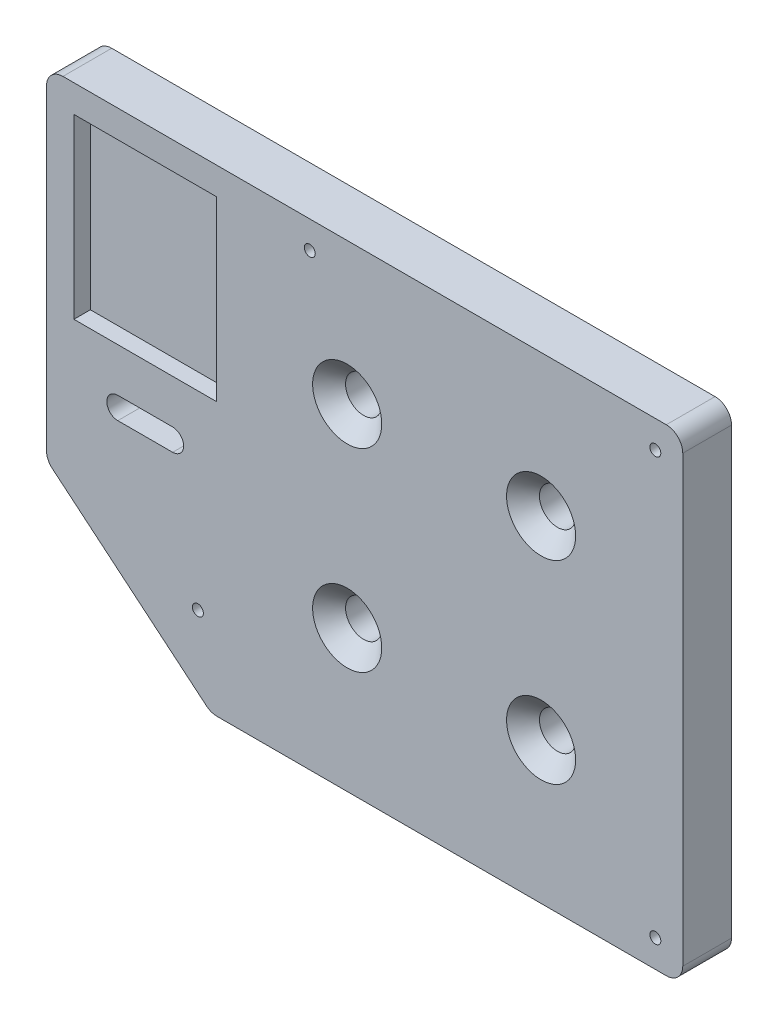
ISO-10303-21;
HEADER;
FILE_DESCRIPTION(('STEP AP214'),'2;1');
FILE_NAME('part.step','',(''),(''),'','','');
FILE_SCHEMA(('AUTOMOTIVE_DESIGN { 1 0 10303 214 1 1 1 1 }'));
ENDSEC;
DATA;
#1=APPLICATION_CONTEXT('core data for automotive mechanical design processes');
#2=APPLICATION_PROTOCOL_DEFINITION('international standard','automotive_design',2000,#1);
#3=PRODUCT_CONTEXT('',#1,'mechanical');
#4=PRODUCT('Part','Part','',(#3));
#5=PRODUCT_RELATED_PRODUCT_CATEGORY('part','',(#4));
#6=PRODUCT_DEFINITION_FORMATION('','',#4);
#7=PRODUCT_DEFINITION_CONTEXT('part definition',#1,'design');
#8=PRODUCT_DEFINITION('design','',#6,#7);
#9=PRODUCT_DEFINITION_SHAPE('','',#8);
#10=(LENGTH_UNIT() NAMED_UNIT(*) SI_UNIT(.MILLI.,.METRE.));
#11=(NAMED_UNIT(*) PLANE_ANGLE_UNIT() SI_UNIT($,.RADIAN.));
#12=(NAMED_UNIT(*) SI_UNIT($,.STERADIAN.) SOLID_ANGLE_UNIT());
#13=UNCERTAINTY_MEASURE_WITH_UNIT(LENGTH_MEASURE(1.E-05),#10,'distance_accuracy_value','');
#14=(GEOMETRIC_REPRESENTATION_CONTEXT(3) GLOBAL_UNCERTAINTY_ASSIGNED_CONTEXT((#13)) GLOBAL_UNIT_ASSIGNED_CONTEXT((#10,
#11,#12)) REPRESENTATION_CONTEXT('',''));
#15=CARTESIAN_POINT('',(0.,0.,0.));
#16=DIRECTION('',(0.,0.,1.));
#17=DIRECTION('',(1.,0.,0.));
#18=AXIS2_PLACEMENT_3D('',#15,#16,#17);
#19=CARTESIAN_POINT('',(0.,0.,-6.));
#20=DIRECTION('',(0.,0.,1.));
#21=DIRECTION('',(1.,0.,0.));
#22=AXIS2_PLACEMENT_3D('',#19,#20,#21);
#23=CYLINDRICAL_SURFACE('',#22,37.5);
#24=CARTESIAN_POINT('',(0.,0.,-4.));
#25=DIRECTION('',(0.,0.,-1.));
#26=DIRECTION('',(-1.,0.,0.));
#27=AXIS2_PLACEMENT_3D('',#24,#25,#26);
#28=CIRCLE('',#27,37.5);
#29=CARTESIAN_POINT('',(-37.5,0.,-4.));
#30=VERTEX_POINT('',#29);
#31=EDGE_CURVE('E299',#30,#30,#28,.T.);
#32=ORIENTED_EDGE('',*,*,#31,.T.);
#33=EDGE_LOOP('',(#32));
#34=FACE_BOUND('',#33,.T.);
#35=CARTESIAN_POINT('',(0.,0.,-6.));
#36=DIRECTION('',(0.,0.,1.));
#37=DIRECTION('',(1.,0.,0.));
#38=AXIS2_PLACEMENT_3D('',#35,#36,#37);
#39=CIRCLE('',#38,37.5);
#40=CARTESIAN_POINT('',(37.5,0.,-6.));
#41=VERTEX_POINT('',#40);
#42=EDGE_CURVE('E293',#41,#41,#39,.T.);
#43=ORIENTED_EDGE('',*,*,#42,.T.);
#44=EDGE_LOOP('',(#43));
#45=FACE_BOUND('',#44,.T.);
#46=ADVANCED_FACE('F33',(#34,#45),#23,.T.);
#47=CARTESIAN_POINT('',(0.,0.,-6.));
#48=DIRECTION('',(0.,0.,1.));
#49=DIRECTION('',(1.,0.,0.));
#50=AXIS2_PLACEMENT_3D('',#47,#48,#49);
#51=PLANE('',#50);
#52=CARTESIAN_POINT('',(0.,0.,-6.));
#53=DIRECTION('',(0.,0.,-1.));
#54=DIRECTION('',(-1.,0.,0.));
#55=AXIS2_PLACEMENT_3D('',#52,#53,#54);
#56=CIRCLE('',#55,31.7);
#57=CARTESIAN_POINT('',(-31.7,0.,-6.));
#58=VERTEX_POINT('',#57);
#59=EDGE_CURVE('E287',#58,#58,#56,.T.);
#60=ORIENTED_EDGE('',*,*,#59,.F.);
#61=EDGE_LOOP('',(#60));
#62=FACE_BOUND('',#61,.T.);
#63=ORIENTED_EDGE('',*,*,#42,.F.);
#64=EDGE_LOOP('',(#63));
#65=FACE_BOUND('',#64,.T.);
#66=ADVANCED_FACE('F397',(#62,#65),#51,.F.);
#67=CARTESIAN_POINT('',(0.,0.,89.6611398544542));
#68=DIRECTION('',(0.,0.,-1.));
#69=DIRECTION('',(-1.,0.,0.));
#70=AXIS2_PLACEMENT_3D('',#67,#68,#69);
#71=CYLINDRICAL_SURFACE('',#70,31.7);
#72=ORIENTED_EDGE('',*,*,#59,.T.);
#73=EDGE_LOOP('',(#72));
#74=FACE_BOUND('',#73,.T.);
#75=CARTESIAN_POINT('',(0.,0.,0.));
#76=DIRECTION('',(0.,0.,1.));
#77=DIRECTION('',(1.,0.,0.));
#78=AXIS2_PLACEMENT_3D('',#75,#76,#77);
#79=CIRCLE('',#78,31.7);
#80=CARTESIAN_POINT('',(31.7,0.,0.));
#81=VERTEX_POINT('',#80);
#82=EDGE_CURVE('E290',#81,#81,#79,.F.);
#83=ORIENTED_EDGE('',*,*,#82,.F.);
#84=EDGE_LOOP('',(#83));
#85=FACE_BOUND('',#84,.T.);
#86=ADVANCED_FACE('F403',(#74,#85),#71,.F.);
#87=CARTESIAN_POINT('',(0.,0.,0.));
#88=DIRECTION('',(0.,0.,-1.));
#89=DIRECTION('',(-1.,0.,0.));
#90=AXIS2_PLACEMENT_3D('',#87,#88,#89);
#91=PLANE('',#90);
#92=CARTESIAN_POINT('',(38.5,-38.5,0.));
#93=DIRECTION('',(0.,0.,-1.));
#94=DIRECTION('',(-1.,0.,0.));
#95=AXIS2_PLACEMENT_3D('',#92,#93,#94);
#96=CIRCLE('',#95,0.999999999999998);
#97=CARTESIAN_POINT('',(37.5,-38.5,0.));
#98=VERTEX_POINT('',#97);
#99=EDGE_CURVE('E787',#98,#98,#96,.F.);
#100=ORIENTED_EDGE('',*,*,#99,.T.);
#101=EDGE_LOOP('',(#100));
#102=FACE_BOUND('',#101,.T.);
#103=CARTESIAN_POINT('',(38.5,38.5,0.));
#104=DIRECTION('',(0.,0.,-1.));
#105=DIRECTION('',(-1.,0.,0.));
#106=AXIS2_PLACEMENT_3D('',#103,#104,#105);
#107=CIRCLE('',#106,0.999999999999998);
#108=CARTESIAN_POINT('',(37.5,38.5,0.));
#109=VERTEX_POINT('',#108);
#110=EDGE_CURVE('E791',#109,#109,#107,.F.);
#111=ORIENTED_EDGE('',*,*,#110,.T.);
#112=EDGE_LOOP('',(#111));
#113=FACE_BOUND('',#112,.T.);
#114=CARTESIAN_POINT('',(-24.5,38.5,0.));
#115=DIRECTION('',(0.,0.,-1.));
#116=DIRECTION('',(-1.,0.,0.));
#117=AXIS2_PLACEMENT_3D('',#114,#115,#116);
#118=CIRCLE('',#117,0.999999999999998);
#119=CARTESIAN_POINT('',(-25.5,38.5,0.));
#120=VERTEX_POINT('',#119);
#121=EDGE_CURVE('E795',#120,#120,#118,.F.);
#122=ORIENTED_EDGE('',*,*,#121,.T.);
#123=EDGE_LOOP('',(#122));
#124=FACE_BOUND('',#123,.T.);
#125=CARTESIAN_POINT('',(-44.898080813822,-28.4620661203998,0.));
#126=DIRECTION('',(0.,0.,-1.));
#127=DIRECTION('',(-1.,0.,0.));
#128=AXIS2_PLACEMENT_3D('',#125,#126,#127);
#129=CIRCLE('',#128,0.999999999999998);
#130=CARTESIAN_POINT('',(-45.898080813822,-28.4620661203998,0.));
#131=VERTEX_POINT('',#130);
#132=EDGE_CURVE('E798',#131,#131,#129,.F.);
#133=ORIENTED_EDGE('',*,*,#132,.T.);
#134=EDGE_LOOP('',(#133));
#135=FACE_BOUND('',#134,.T.);
#136=DIRECTION('',(-1.,0.,0.));
#137=VECTOR('',#136,1.);
#138=CARTESIAN_POINT('',(-49.5,-1.85000000000001,0.));
#139=LINE('',#138,#137);
#140=CARTESIAN_POINT('',(-49.5,-1.85000000000001,0.));
#141=VERTEX_POINT('',#140);
#142=CARTESIAN_POINT('',(-59.5,-1.85000000000001,0.));
#143=VERTEX_POINT('',#142);
#144=EDGE_CURVE('E173',#141,#143,#139,.T.);
#145=ORIENTED_EDGE('',*,*,#144,.T.);
#146=CARTESIAN_POINT('',(-59.5,-3.85000000000001,0.));
#147=DIRECTION('',(0.,0.,-1.));
#148=DIRECTION('',(-1.,0.,0.));
#149=AXIS2_PLACEMENT_3D('',#146,#147,#148);
#150=CIRCLE('',#149,2.);
#151=CARTESIAN_POINT('',(-59.5,-5.85000000000001,0.));
#152=VERTEX_POINT('',#151);
#153=EDGE_CURVE('E159',#143,#152,#150,.F.);
#154=ORIENTED_EDGE('',*,*,#153,.T.);
#155=DIRECTION('',(1.,0.,0.));
#156=VECTOR('',#155,1.);
#157=CARTESIAN_POINT('',(-49.5,-5.85,0.));
#158=LINE('',#157,#156);
#159=CARTESIAN_POINT('',(-49.5,-5.85,0.));
#160=VERTEX_POINT('',#159);
#161=EDGE_CURVE('E192',#152,#160,#158,.T.);
#162=ORIENTED_EDGE('',*,*,#161,.T.);
#163=CARTESIAN_POINT('',(-49.5,-3.85000000000001,0.));
#164=DIRECTION('',(0.,0.,-1.));
#165=DIRECTION('',(-1.,0.,0.));
#166=AXIS2_PLACEMENT_3D('',#163,#164,#165);
#167=CIRCLE('',#166,2.);
#168=EDGE_CURVE('E180',#160,#141,#167,.F.);
#169=ORIENTED_EDGE('',*,*,#168,.T.);
#170=EDGE_LOOP('',(#145,#154,#162,#169));
#171=FACE_BOUND('',#170,.T.);
#172=DIRECTION('',(0.,1.,0.));
#173=VECTOR('',#172,1.);
#174=CARTESIAN_POINT('',(43.5,-43.5,0.));
#175=LINE('',#174,#173);
#176=CARTESIAN_POINT('',(43.5,-40.5,0.));
#177=VERTEX_POINT('',#176);
#178=CARTESIAN_POINT('',(43.5,40.5,0.));
#179=VERTEX_POINT('',#178);
#180=EDGE_CURVE('E236',#177,#179,#175,.T.);
#181=ORIENTED_EDGE('',*,*,#180,.F.);
#182=CARTESIAN_POINT('',(40.5,-40.5,0.));
#183=DIRECTION('',(0.,0.,-1.));
#184=DIRECTION('',(-1.,0.,0.));
#185=AXIS2_PLACEMENT_3D('',#182,#183,#184);
#186=CIRCLE('',#185,3.);
#187=CARTESIAN_POINT('',(40.5,-43.5,0.));
#188=VERTEX_POINT('',#187);
#189=EDGE_CURVE('E337',#177,#188,#186,.T.);
#190=ORIENTED_EDGE('',*,*,#189,.T.);
#191=DIRECTION('',(1.,0.,0.));
#192=VECTOR('',#191,1.);
#193=CARTESIAN_POINT('',(43.5,-43.5,0.));
#194=LINE('',#193,#192);
#195=CARTESIAN_POINT('',(-41.413850194456,-43.5,0.));
#196=VERTEX_POINT('',#195);
#197=EDGE_CURVE('E255',#196,#188,#194,.T.);
#198=ORIENTED_EDGE('',*,*,#197,.F.);
#199=CARTESIAN_POINT('',(-41.413850194456,-40.5,0.));
#200=DIRECTION('',(0.,0.,-1.));
#201=DIRECTION('',(-1.,0.,0.));
#202=AXIS2_PLACEMENT_3D('',#199,#200,#201);
#203=CIRCLE('',#202,3.);
#204=CARTESIAN_POINT('',(-43.3344033934495,-42.8046638387921,0.));
#205=VERTEX_POINT('',#204);
#206=EDGE_CURVE('E335',#196,#205,#203,.T.);
#207=ORIENTED_EDGE('',*,*,#206,.T.);
#208=DIRECTION('',(-0.768221279597376,0.64018439966448,0.));
#209=VECTOR('',#208,1.);
#210=CARTESIAN_POINT('',(-42.5,-43.5,0.));
#211=LINE('',#210,#209);
#212=CARTESIAN_POINT('',(-71.4205531989934,-19.3995390008388,0.));
#213=VERTEX_POINT('',#212);
#214=EDGE_CURVE('E233',#205,#213,#211,.T.);
#215=ORIENTED_EDGE('',*,*,#214,.T.);
#216=CARTESIAN_POINT('',(-69.5,-17.0948751620467,0.));
#217=DIRECTION('',(0.,0.,-1.));
#218=DIRECTION('',(-1.,0.,0.));
#219=AXIS2_PLACEMENT_3D('',#216,#217,#218);
#220=CIRCLE('',#219,3.);
#221=CARTESIAN_POINT('',(-72.5,-17.0948751620467,0.));
#222=VERTEX_POINT('',#221);
#223=EDGE_CURVE('E333',#213,#222,#220,.T.);
#224=ORIENTED_EDGE('',*,*,#223,.T.);
#225=DIRECTION('',(0.,-1.,0.));
#226=VECTOR('',#225,1.);
#227=CARTESIAN_POINT('',(-72.5,-43.5,0.));
#228=LINE('',#227,#226);
#229=CARTESIAN_POINT('',(-72.5,40.5,0.));
#230=VERTEX_POINT('',#229);
#231=EDGE_CURVE('E252',#230,#222,#228,.T.);
#232=ORIENTED_EDGE('',*,*,#231,.F.);
#233=CARTESIAN_POINT('',(-69.5,40.5,0.));
#234=DIRECTION('',(0.,0.,-1.));
#235=DIRECTION('',(-1.,0.,0.));
#236=AXIS2_PLACEMENT_3D('',#233,#234,#235);
#237=CIRCLE('',#236,3.);
#238=CARTESIAN_POINT('',(-69.5,43.5,0.));
#239=VERTEX_POINT('',#238);
#240=EDGE_CURVE('E48',#230,#239,#237,.T.);
#241=ORIENTED_EDGE('',*,*,#240,.T.);
#242=DIRECTION('',(-1.,0.,0.));
#243=VECTOR('',#242,1.);
#244=CARTESIAN_POINT('',(43.5,43.5,0.));
#245=LINE('',#244,#243);
#246=CARTESIAN_POINT('',(40.5,43.5,0.));
#247=VERTEX_POINT('',#246);
#248=EDGE_CURVE('E250',#247,#239,#245,.T.);
#249=ORIENTED_EDGE('',*,*,#248,.F.);
#250=CARTESIAN_POINT('',(40.5,40.5,0.));
#251=DIRECTION('',(0.,0.,-1.));
#252=DIRECTION('',(-1.,0.,0.));
#253=AXIS2_PLACEMENT_3D('',#250,#251,#252);
#254=CIRCLE('',#253,3.);
#255=EDGE_CURVE('E330',#247,#179,#254,.T.);
#256=ORIENTED_EDGE('',*,*,#255,.T.);
#257=EDGE_LOOP('',(#181,#190,#198,#207,#215,#224,#232,#241,#249,#256));
#258=FACE_BOUND('',#257,.T.);
#259=CARTESIAN_POINT('',(0.,0.,0.));
#260=DIRECTION('',(0.,0.,-1.));
#261=DIRECTION('',(-1.,0.,0.));
#262=AXIS2_PLACEMENT_3D('',#259,#260,#261);
#263=CIRCLE('',#262,41.5);
#264=CARTESIAN_POINT('',(-41.5,0.,0.));
#265=VERTEX_POINT('',#264);
#266=EDGE_CURVE('E296',#265,#265,#263,.F.);
#267=ORIENTED_EDGE('',*,*,#266,.T.);
#268=EDGE_LOOP('',(#267));
#269=FACE_BOUND('',#268,.T.);
#270=ADVANCED_FACE('F179',(#102,#113,#124,#135,#171,#258,#269),#91,.T.);
#271=CARTESIAN_POINT('',(-17.6776695296638,17.6776695296636,0.));
#272=DIRECTION('',(0.,0.,-1.));
#273=DIRECTION('',(-1.,0.,0.));
#274=AXIS2_PLACEMENT_3D('',#271,#272,#273);
#275=CIRCLE('',#274,3.3);
#276=CARTESIAN_POINT('',(-20.9776695296638,17.6776695296636,0.));
#277=VERTEX_POINT('',#276);
#278=EDGE_CURVE('E265',#277,#277,#275,.T.);
#279=ORIENTED_EDGE('',*,*,#278,.F.);
#280=EDGE_LOOP('',(#279));
#281=FACE_BOUND('',#280,.T.);
#282=CARTESIAN_POINT('',(-17.6776695296637,-17.6776695296637,0.));
#283=DIRECTION('',(0.,0.,-1.));
#284=DIRECTION('',(-1.,0.,0.));
#285=AXIS2_PLACEMENT_3D('',#282,#283,#284);
#286=CIRCLE('',#285,3.3);
#287=CARTESIAN_POINT('',(-20.9776695296637,-17.6776695296637,0.));
#288=VERTEX_POINT('',#287);
#289=EDGE_CURVE('E272',#288,#288,#286,.T.);
#290=ORIENTED_EDGE('',*,*,#289,.F.);
#291=EDGE_LOOP('',(#290));
#292=FACE_BOUND('',#291,.T.);
#293=CARTESIAN_POINT('',(17.6776695296638,-17.6776695296636,0.));
#294=DIRECTION('',(0.,0.,-1.));
#295=DIRECTION('',(-1.,0.,0.));
#296=AXIS2_PLACEMENT_3D('',#293,#294,#295);
#297=CIRCLE('',#296,3.3);
#298=CARTESIAN_POINT('',(14.3776695296638,-17.6776695296636,0.));
#299=VERTEX_POINT('',#298);
#300=EDGE_CURVE('E279',#299,#299,#297,.T.);
#301=ORIENTED_EDGE('',*,*,#300,.F.);
#302=EDGE_LOOP('',(#301));
#303=FACE_BOUND('',#302,.T.);
#304=CARTESIAN_POINT('',(17.6776695296637,17.6776695296637,0.));
#305=DIRECTION('',(0.,0.,-1.));
#306=DIRECTION('',(-1.,0.,0.));
#307=AXIS2_PLACEMENT_3D('',#304,#305,#306);
#308=CIRCLE('',#307,3.3);
#309=CARTESIAN_POINT('',(14.3776695296637,17.6776695296637,0.));
#310=VERTEX_POINT('',#309);
#311=EDGE_CURVE('E286',#310,#310,#308,.T.);
#312=ORIENTED_EDGE('',*,*,#311,.F.);
#313=EDGE_LOOP('',(#312));
#314=FACE_BOUND('',#313,.T.);
#315=ORIENTED_EDGE('',*,*,#82,.T.);
#316=EDGE_LOOP('',(#315));
#317=FACE_BOUND('',#316,.T.);
#318=ADVANCED_FACE('F412',(#281,#292,#303,#314,#317),#91,.T.);
#319=CARTESIAN_POINT('',(0.,0.,-4.));
#320=DIRECTION('',(0.,0.,-1.));
#321=DIRECTION('',(-1.,0.,0.));
#322=AXIS2_PLACEMENT_3D('',#319,#320,#321);
#323=TOROIDAL_SURFACE('',#322,41.5,4.);
#324=ORIENTED_EDGE('',*,*,#31,.F.);
#325=EDGE_LOOP('',(#324));
#326=FACE_BOUND('',#325,.T.);
#327=ORIENTED_EDGE('',*,*,#266,.F.);
#328=EDGE_LOOP('',(#327));
#329=FACE_BOUND('',#328,.T.);
#330=ADVANCED_FACE('F409',(#326,#329),#323,.F.);
#331=CARTESIAN_POINT('',(0.,0.,8.89));
#332=DIRECTION('',(0.,0.,-1.));
#333=DIRECTION('',(-1.,0.,0.));
#334=AXIS2_PLACEMENT_3D('',#331,#332,#333);
#335=PLANE('',#334);
#336=CARTESIAN_POINT('',(38.5,-38.5,8.89));
#337=DIRECTION('',(0.,0.,1.));
#338=DIRECTION('',(1.,0.,0.));
#339=AXIS2_PLACEMENT_3D('',#336,#337,#338);
#340=CIRCLE('',#339,0.999999999999998);
#341=CARTESIAN_POINT('',(39.5,-38.5,8.89));
#342=VERTEX_POINT('',#341);
#343=EDGE_CURVE('E811',#342,#342,#340,.T.);
#344=ORIENTED_EDGE('',*,*,#343,.F.);
#345=EDGE_LOOP('',(#344));
#346=FACE_BOUND('',#345,.T.);
#347=CARTESIAN_POINT('',(38.5,38.5,8.89));
#348=DIRECTION('',(0.,0.,1.));
#349=DIRECTION('',(1.,0.,0.));
#350=AXIS2_PLACEMENT_3D('',#347,#348,#349);
#351=CIRCLE('',#350,0.999999999999998);
#352=CARTESIAN_POINT('',(39.5,38.5,8.89));
#353=VERTEX_POINT('',#352);
#354=EDGE_CURVE('E815',#353,#353,#351,.T.);
#355=ORIENTED_EDGE('',*,*,#354,.F.);
#356=EDGE_LOOP('',(#355));
#357=FACE_BOUND('',#356,.T.);
#358=CARTESIAN_POINT('',(-24.5,38.5,8.89));
#359=DIRECTION('',(0.,0.,1.));
#360=DIRECTION('',(1.,0.,0.));
#361=AXIS2_PLACEMENT_3D('',#358,#359,#360);
#362=CIRCLE('',#361,0.999999999999998);
#363=CARTESIAN_POINT('',(-23.5,38.5,8.89));
#364=VERTEX_POINT('',#363);
#365=EDGE_CURVE('E800',#364,#364,#362,.T.);
#366=ORIENTED_EDGE('',*,*,#365,.F.);
#367=EDGE_LOOP('',(#366));
#368=FACE_BOUND('',#367,.T.);
#369=CARTESIAN_POINT('',(-44.898080813822,-28.4620661203998,8.89));
#370=DIRECTION('',(0.,0.,1.));
#371=DIRECTION('',(1.,0.,0.));
#372=AXIS2_PLACEMENT_3D('',#369,#370,#371);
#373=CIRCLE('',#372,0.999999999999998);
#374=CARTESIAN_POINT('',(-43.898080813822,-28.4620661203998,8.89));
#375=VERTEX_POINT('',#374);
#376=EDGE_CURVE('E801',#375,#375,#373,.T.);
#377=ORIENTED_EDGE('',*,*,#376,.F.);
#378=EDGE_LOOP('',(#377));
#379=FACE_BOUND('',#378,.T.);
#380=CARTESIAN_POINT('',(-59.5,-3.85000000000001,8.89));
#381=DIRECTION('',(0.,0.,1.));
#382=DIRECTION('',(1.,0.,0.));
#383=AXIS2_PLACEMENT_3D('',#380,#381,#382);
#384=CIRCLE('',#383,2.);
#385=CARTESIAN_POINT('',(-59.5,-1.85000000000001,8.89));
#386=VERTEX_POINT('',#385);
#387=CARTESIAN_POINT('',(-59.5,-5.85000000000001,8.89));
#388=VERTEX_POINT('',#387);
#389=EDGE_CURVE('E183',#386,#388,#384,.T.);
#390=ORIENTED_EDGE('',*,*,#389,.F.);
#391=DIRECTION('',(-1.,0.,0.));
#392=VECTOR('',#391,1.);
#393=CARTESIAN_POINT('',(-49.5,-1.85000000000001,8.89));
#394=LINE('',#393,#392);
#395=CARTESIAN_POINT('',(-49.5,-1.85000000000001,8.89));
#396=VERTEX_POINT('',#395);
#397=EDGE_CURVE('E176',#396,#386,#394,.T.);
#398=ORIENTED_EDGE('',*,*,#397,.F.);
#399=CARTESIAN_POINT('',(-49.5,-3.85000000000001,8.89));
#400=DIRECTION('',(0.,0.,1.));
#401=DIRECTION('',(1.,0.,0.));
#402=AXIS2_PLACEMENT_3D('',#399,#400,#401);
#403=CIRCLE('',#402,2.);
#404=CARTESIAN_POINT('',(-49.5,-5.85,8.89));
#405=VERTEX_POINT('',#404);
#406=EDGE_CURVE('E187',#405,#396,#403,.T.);
#407=ORIENTED_EDGE('',*,*,#406,.F.);
#408=DIRECTION('',(1.,0.,0.));
#409=VECTOR('',#408,1.);
#410=CARTESIAN_POINT('',(-49.5,-5.85,8.89));
#411=LINE('',#410,#409);
#412=EDGE_CURVE('E181',#388,#405,#411,.T.);
#413=ORIENTED_EDGE('',*,*,#412,.F.);
#414=EDGE_LOOP('',(#390,#398,#407,#413));
#415=FACE_BOUND('',#414,.T.);
#416=DIRECTION('',(0.,-1.,0.));
#417=VECTOR('',#416,1.);
#418=CARTESIAN_POINT('',(-67.5,38.5,8.89));
#419=LINE('',#418,#417);
#420=CARTESIAN_POINT('',(-67.5,38.5,8.89));
#421=VERTEX_POINT('',#420);
#422=CARTESIAN_POINT('',(-67.5,6.14999999999999,8.89));
#423=VERTEX_POINT('',#422);
#424=EDGE_CURVE('E214',#421,#423,#419,.T.);
#425=ORIENTED_EDGE('',*,*,#424,.F.);
#426=DIRECTION('',(-1.,0.,0.));
#427=VECTOR('',#426,1.);
#428=CARTESIAN_POINT('',(-41.5,38.5,8.89));
#429=LINE('',#428,#427);
#430=CARTESIAN_POINT('',(-41.5,38.5,8.89));
#431=VERTEX_POINT('',#430);
#432=EDGE_CURVE('E198',#431,#421,#429,.T.);
#433=ORIENTED_EDGE('',*,*,#432,.F.);
#434=DIRECTION('',(0.,1.,0.));
#435=VECTOR('',#434,1.);
#436=CARTESIAN_POINT('',(-41.5,6.14999999999999,8.89));
#437=LINE('',#436,#435);
#438=CARTESIAN_POINT('',(-41.5,6.14999999999999,8.89));
#439=VERTEX_POINT('',#438);
#440=EDGE_CURVE('E203',#439,#431,#437,.T.);
#441=ORIENTED_EDGE('',*,*,#440,.F.);
#442=DIRECTION('',(1.,0.,0.));
#443=VECTOR('',#442,1.);
#444=CARTESIAN_POINT('',(-67.5,6.14999999999999,8.89));
#445=LINE('',#444,#443);
#446=EDGE_CURVE('E217',#423,#439,#445,.T.);
#447=ORIENTED_EDGE('',*,*,#446,.F.);
#448=EDGE_LOOP('',(#425,#433,#441,#447));
#449=FACE_BOUND('',#448,.T.);
#450=CARTESIAN_POINT('',(-17.6776695296638,17.6776695296636,8.89));
#451=DIRECTION('',(0.,0.,1.));
#452=DIRECTION('',(1.,0.,0.));
#453=AXIS2_PLACEMENT_3D('',#450,#451,#452);
#454=CIRCLE('',#453,6.3);
#455=CARTESIAN_POINT('',(-11.3776695296638,17.6776695296636,8.89));
#456=VERTEX_POINT('',#455);
#457=EDGE_CURVE('E240',#456,#456,#454,.T.);
#458=ORIENTED_EDGE('',*,*,#457,.F.);
#459=EDGE_LOOP('',(#458));
#460=FACE_BOUND('',#459,.T.);
#461=CARTESIAN_POINT('',(-17.6776695296637,-17.6776695296637,8.89));
#462=DIRECTION('',(0.,0.,1.));
#463=DIRECTION('',(1.,0.,0.));
#464=AXIS2_PLACEMENT_3D('',#461,#462,#463);
#465=CIRCLE('',#464,6.3);
#466=CARTESIAN_POINT('',(-11.3776695296637,-17.6776695296637,8.89));
#467=VERTEX_POINT('',#466);
#468=EDGE_CURVE('E266',#467,#467,#465,.T.);
#469=ORIENTED_EDGE('',*,*,#468,.F.);
#470=EDGE_LOOP('',(#469));
#471=FACE_BOUND('',#470,.T.);
#472=CARTESIAN_POINT('',(17.6776695296638,-17.6776695296636,8.89));
#473=DIRECTION('',(0.,0.,1.));
#474=DIRECTION('',(1.,0.,0.));
#475=AXIS2_PLACEMENT_3D('',#472,#473,#474);
#476=CIRCLE('',#475,6.3);
#477=CARTESIAN_POINT('',(23.9776695296638,-17.6776695296636,8.89));
#478=VERTEX_POINT('',#477);
#479=EDGE_CURVE('E273',#478,#478,#476,.T.);
#480=ORIENTED_EDGE('',*,*,#479,.F.);
#481=EDGE_LOOP('',(#480));
#482=FACE_BOUND('',#481,.T.);
#483=CARTESIAN_POINT('',(17.6776695296637,17.6776695296637,8.89));
#484=DIRECTION('',(0.,0.,1.));
#485=DIRECTION('',(1.,0.,0.));
#486=AXIS2_PLACEMENT_3D('',#483,#484,#485);
#487=CIRCLE('',#486,6.3);
#488=CARTESIAN_POINT('',(23.9776695296637,17.6776695296637,8.89));
#489=VERTEX_POINT('',#488);
#490=EDGE_CURVE('E280',#489,#489,#487,.T.);
#491=ORIENTED_EDGE('',*,*,#490,.F.);
#492=EDGE_LOOP('',(#491));
#493=FACE_BOUND('',#492,.T.);
#494=DIRECTION('',(1.,0.,0.));
#495=VECTOR('',#494,1.);
#496=CARTESIAN_POINT('',(43.5,-43.5,8.89));
#497=LINE('',#496,#495);
#498=CARTESIAN_POINT('',(-41.413850194456,-43.5,8.89));
#499=VERTEX_POINT('',#498);
#500=CARTESIAN_POINT('',(40.5,-43.5,8.89));
#501=VERTEX_POINT('',#500);
#502=EDGE_CURVE('E237',#499,#501,#497,.T.);
#503=ORIENTED_EDGE('',*,*,#502,.T.);
#504=CARTESIAN_POINT('',(40.5,-40.5,8.89000000000001));
#505=DIRECTION('',(0.,0.,-1.));
#506=DIRECTION('',(-1.,0.,0.));
#507=AXIS2_PLACEMENT_3D('',#504,#505,#506);
#508=CIRCLE('',#507,3.);
#509=CARTESIAN_POINT('',(43.5,-40.5,8.89));
#510=VERTEX_POINT('',#509);
#511=EDGE_CURVE('E323',#501,#510,#508,.F.);
#512=ORIENTED_EDGE('',*,*,#511,.T.);
#513=DIRECTION('',(0.,1.,0.));
#514=VECTOR('',#513,1.);
#515=CARTESIAN_POINT('',(43.5,-43.5,8.89));
#516=LINE('',#515,#514);
#517=CARTESIAN_POINT('',(43.5,40.5,8.89));
#518=VERTEX_POINT('',#517);
#519=EDGE_CURVE('E247',#510,#518,#516,.T.);
#520=ORIENTED_EDGE('',*,*,#519,.T.);
#521=CARTESIAN_POINT('',(40.5,40.5,8.89000000000001));
#522=DIRECTION('',(0.,0.,-1.));
#523=DIRECTION('',(-1.,0.,0.));
#524=AXIS2_PLACEMENT_3D('',#521,#522,#523);
#525=CIRCLE('',#524,3.);
#526=CARTESIAN_POINT('',(40.5,43.5,8.89));
#527=VERTEX_POINT('',#526);
#528=EDGE_CURVE('E315',#518,#527,#525,.F.);
#529=ORIENTED_EDGE('',*,*,#528,.T.);
#530=DIRECTION('',(-1.,0.,0.));
#531=VECTOR('',#530,1.);
#532=CARTESIAN_POINT('',(43.5,43.5,8.89));
#533=LINE('',#532,#531);
#534=CARTESIAN_POINT('',(-69.5,43.5,8.89));
#535=VERTEX_POINT('',#534);
#536=EDGE_CURVE('E244',#527,#535,#533,.T.);
#537=ORIENTED_EDGE('',*,*,#536,.T.);
#538=CARTESIAN_POINT('',(-69.5,40.5,8.89000000000001));
#539=DIRECTION('',(0.,0.,-1.));
#540=DIRECTION('',(-1.,0.,0.));
#541=AXIS2_PLACEMENT_3D('',#538,#539,#540);
#542=CIRCLE('',#541,3.);
#543=CARTESIAN_POINT('',(-72.5,40.5,8.89));
#544=VERTEX_POINT('',#543);
#545=EDGE_CURVE('E317',#535,#544,#542,.F.);
#546=ORIENTED_EDGE('',*,*,#545,.T.);
#547=DIRECTION('',(0.,-1.,0.));
#548=VECTOR('',#547,1.);
#549=CARTESIAN_POINT('',(-72.5,-43.5,8.89));
#550=LINE('',#549,#548);
#551=CARTESIAN_POINT('',(-72.5,-17.0948751620467,8.89));
#552=VERTEX_POINT('',#551);
#553=EDGE_CURVE('E241',#544,#552,#550,.T.);
#554=ORIENTED_EDGE('',*,*,#553,.T.);
#555=CARTESIAN_POINT('',(-69.5,-17.0948751620467,8.89000000000001));
#556=DIRECTION('',(0.,0.,-1.));
#557=DIRECTION('',(-1.,0.,0.));
#558=AXIS2_PLACEMENT_3D('',#555,#556,#557);
#559=CIRCLE('',#558,3.);
#560=CARTESIAN_POINT('',(-71.4205531989934,-19.3995390008388,8.89));
#561=VERTEX_POINT('',#560);
#562=EDGE_CURVE('E319',#552,#561,#559,.F.);
#563=ORIENTED_EDGE('',*,*,#562,.T.);
#564=DIRECTION('',(-0.768221279597376,0.64018439966448,0.));
#565=VECTOR('',#564,1.);
#566=CARTESIAN_POINT('',(-42.5,-43.5,8.89));
#567=LINE('',#566,#565);
#568=CARTESIAN_POINT('',(-43.3344033934495,-42.8046638387921,8.89));
#569=VERTEX_POINT('',#568);
#570=EDGE_CURVE('E224',#569,#561,#567,.T.);
#571=ORIENTED_EDGE('',*,*,#570,.F.);
#572=CARTESIAN_POINT('',(-41.413850194456,-40.5,8.89));
#573=DIRECTION('',(0.,0.,-1.));
#574=DIRECTION('',(-1.,0.,0.));
#575=AXIS2_PLACEMENT_3D('',#572,#573,#574);
#576=CIRCLE('',#575,3.);
#577=EDGE_CURVE('E321',#569,#499,#576,.F.);
#578=ORIENTED_EDGE('',*,*,#577,.T.);
#579=EDGE_LOOP('',(#503,#512,#520,#529,#537,#546,#554,#563,#571,#578));
#580=FACE_BOUND('',#579,.T.);
#581=ADVANCED_FACE('F356',(#346,#357,#368,#379,#415,#449,#460,#471,#482,#493,#580),#335,.F.);
#582=CARTESIAN_POINT('',(17.6776695296637,17.6776695296637,8.89));
#583=DIRECTION('',(0.,0.,1.));
#584=DIRECTION('',(1.,0.,0.));
#585=AXIS2_PLACEMENT_3D('',#582,#583,#584);
#586=CYLINDRICAL_SURFACE('',#585,3.3);
#587=ORIENTED_EDGE('',*,*,#311,.T.);
#588=EDGE_LOOP('',(#587));
#589=FACE_BOUND('',#588,.T.);
#590=CARTESIAN_POINT('',(17.6776695296637,17.6776695296637,5.89));
#591=DIRECTION('',(0.,0.,1.));
#592=DIRECTION('',(1.,0.,0.));
#593=AXIS2_PLACEMENT_3D('',#590,#591,#592);
#594=CIRCLE('',#593,3.3);
#595=CARTESIAN_POINT('',(20.9776695296637,17.6776695296637,5.89));
#596=VERTEX_POINT('',#595);
#597=EDGE_CURVE('E283',#596,#596,#594,.T.);
#598=ORIENTED_EDGE('',*,*,#597,.T.);
#599=EDGE_LOOP('',(#598));
#600=FACE_BOUND('',#599,.T.);
#601=ADVANCED_FACE('F507',(#589,#600),#586,.F.);
#602=CARTESIAN_POINT('',(17.6776695296637,17.6776695296637,8.89));
#603=DIRECTION('',(0.,0.,1.));
#604=DIRECTION('',(1.,0.,0.));
#605=AXIS2_PLACEMENT_3D('',#602,#603,#604);
#606=CONICAL_SURFACE('',#605,6.3,0.785398163397448);
#607=ORIENTED_EDGE('',*,*,#597,.F.);
#608=EDGE_LOOP('',(#607));
#609=FACE_BOUND('',#608,.T.);
#610=ORIENTED_EDGE('',*,*,#490,.T.);
#611=EDGE_LOOP('',(#610));
#612=FACE_BOUND('',#611,.T.);
#613=ADVANCED_FACE('F503',(#609,#612),#606,.F.);
#614=CARTESIAN_POINT('',(17.6776695296638,-17.6776695296636,8.89));
#615=DIRECTION('',(0.,0.,1.));
#616=DIRECTION('',(1.,0.,0.));
#617=AXIS2_PLACEMENT_3D('',#614,#615,#616);
#618=CYLINDRICAL_SURFACE('',#617,3.3);
#619=ORIENTED_EDGE('',*,*,#300,.T.);
#620=EDGE_LOOP('',(#619));
#621=FACE_BOUND('',#620,.T.);
#622=CARTESIAN_POINT('',(17.6776695296638,-17.6776695296636,5.89));
#623=DIRECTION('',(0.,0.,1.));
#624=DIRECTION('',(1.,0.,0.));
#625=AXIS2_PLACEMENT_3D('',#622,#623,#624);
#626=CIRCLE('',#625,3.3);
#627=CARTESIAN_POINT('',(20.9776695296638,-17.6776695296636,5.89));
#628=VERTEX_POINT('',#627);
#629=EDGE_CURVE('E276',#628,#628,#626,.T.);
#630=ORIENTED_EDGE('',*,*,#629,.T.);
#631=EDGE_LOOP('',(#630));
#632=FACE_BOUND('',#631,.T.);
#633=ADVANCED_FACE('F499',(#621,#632),#618,.F.);
#634=CARTESIAN_POINT('',(17.6776695296638,-17.6776695296636,8.89));
#635=DIRECTION('',(0.,0.,1.));
#636=DIRECTION('',(1.,0.,0.));
#637=AXIS2_PLACEMENT_3D('',#634,#635,#636);
#638=CONICAL_SURFACE('',#637,6.3,0.785398163397448);
#639=ORIENTED_EDGE('',*,*,#629,.F.);
#640=EDGE_LOOP('',(#639));
#641=FACE_BOUND('',#640,.T.);
#642=ORIENTED_EDGE('',*,*,#479,.T.);
#643=EDGE_LOOP('',(#642));
#644=FACE_BOUND('',#643,.T.);
#645=ADVANCED_FACE('F495',(#641,#644),#638,.F.);
#646=CARTESIAN_POINT('',(-17.6776695296637,-17.6776695296637,8.89));
#647=DIRECTION('',(0.,0.,1.));
#648=DIRECTION('',(1.,0.,0.));
#649=AXIS2_PLACEMENT_3D('',#646,#647,#648);
#650=CYLINDRICAL_SURFACE('',#649,3.3);
#651=ORIENTED_EDGE('',*,*,#289,.T.);
#652=EDGE_LOOP('',(#651));
#653=FACE_BOUND('',#652,.T.);
#654=CARTESIAN_POINT('',(-17.6776695296637,-17.6776695296637,5.89));
#655=DIRECTION('',(0.,0.,1.));
#656=DIRECTION('',(1.,0.,0.));
#657=AXIS2_PLACEMENT_3D('',#654,#655,#656);
#658=CIRCLE('',#657,3.3);
#659=CARTESIAN_POINT('',(-14.3776695296637,-17.6776695296637,5.89));
#660=VERTEX_POINT('',#659);
#661=EDGE_CURVE('E269',#660,#660,#658,.T.);
#662=ORIENTED_EDGE('',*,*,#661,.T.);
#663=EDGE_LOOP('',(#662));
#664=FACE_BOUND('',#663,.T.);
#665=ADVANCED_FACE('F491',(#653,#664),#650,.F.);
#666=CARTESIAN_POINT('',(-17.6776695296637,-17.6776695296637,8.89));
#667=DIRECTION('',(0.,0.,1.));
#668=DIRECTION('',(1.,0.,0.));
#669=AXIS2_PLACEMENT_3D('',#666,#667,#668);
#670=CONICAL_SURFACE('',#669,6.3,0.785398163397448);
#671=ORIENTED_EDGE('',*,*,#661,.F.);
#672=EDGE_LOOP('',(#671));
#673=FACE_BOUND('',#672,.T.);
#674=ORIENTED_EDGE('',*,*,#468,.T.);
#675=EDGE_LOOP('',(#674));
#676=FACE_BOUND('',#675,.T.);
#677=ADVANCED_FACE('F487',(#673,#676),#670,.F.);
#678=CARTESIAN_POINT('',(-17.6776695296638,17.6776695296636,8.89));
#679=DIRECTION('',(0.,0.,1.));
#680=DIRECTION('',(1.,0.,0.));
#681=AXIS2_PLACEMENT_3D('',#678,#679,#680);
#682=CYLINDRICAL_SURFACE('',#681,3.3);
#683=ORIENTED_EDGE('',*,*,#278,.T.);
#684=EDGE_LOOP('',(#683));
#685=FACE_BOUND('',#684,.T.);
#686=CARTESIAN_POINT('',(-17.6776695296638,17.6776695296636,5.89));
#687=DIRECTION('',(0.,0.,1.));
#688=DIRECTION('',(1.,0.,0.));
#689=AXIS2_PLACEMENT_3D('',#686,#687,#688);
#690=CIRCLE('',#689,3.3);
#691=CARTESIAN_POINT('',(-14.3776695296638,17.6776695296636,5.89));
#692=VERTEX_POINT('',#691);
#693=EDGE_CURVE('E262',#692,#692,#690,.T.);
#694=ORIENTED_EDGE('',*,*,#693,.T.);
#695=EDGE_LOOP('',(#694));
#696=FACE_BOUND('',#695,.T.);
#697=ADVANCED_FACE('F483',(#685,#696),#682,.F.);
#698=CARTESIAN_POINT('',(-17.6776695296638,17.6776695296636,8.89));
#699=DIRECTION('',(0.,0.,1.));
#700=DIRECTION('',(1.,0.,0.));
#701=AXIS2_PLACEMENT_3D('',#698,#699,#700);
#702=CONICAL_SURFACE('',#701,6.3,0.785398163397448);
#703=ORIENTED_EDGE('',*,*,#693,.F.);
#704=EDGE_LOOP('',(#703));
#705=FACE_BOUND('',#704,.T.);
#706=ORIENTED_EDGE('',*,*,#457,.T.);
#707=EDGE_LOOP('',(#706));
#708=FACE_BOUND('',#707,.T.);
#709=ADVANCED_FACE('F480',(#705,#708),#702,.F.);
#710=CARTESIAN_POINT('',(43.5,-43.5,-145.));
#711=DIRECTION('',(1.,0.,0.));
#712=DIRECTION('',(0.,1.,0.));
#713=AXIS2_PLACEMENT_3D('',#710,#711,#712);
#714=PLANE('',#713);
#715=ORIENTED_EDGE('',*,*,#519,.F.);
#716=DIRECTION('',(0.,0.,1.));
#717=VECTOR('',#716,1.);
#718=CARTESIAN_POINT('',(43.5,-40.5,-145.));
#719=LINE('',#718,#717);
#720=EDGE_CURVE('E328',#510,#177,#719,.F.);
#721=ORIENTED_EDGE('',*,*,#720,.T.);
#722=ORIENTED_EDGE('',*,*,#180,.T.);
#723=DIRECTION('',(0.,0.,1.));
#724=VECTOR('',#723,1.);
#725=CARTESIAN_POINT('',(43.5,40.5,-145.));
#726=LINE('',#725,#724);
#727=EDGE_CURVE('E325',#179,#518,#726,.T.);
#728=ORIENTED_EDGE('',*,*,#727,.T.);
#729=EDGE_LOOP('',(#715,#721,#722,#728));
#730=FACE_BOUND('',#729,.T.);
#731=ADVANCED_FACE('F369',(#730),#714,.T.);
#732=CARTESIAN_POINT('',(43.5,-43.5,-145.));
#733=DIRECTION('',(0.,-1.,0.));
#734=DIRECTION('',(1.,0.,0.));
#735=AXIS2_PLACEMENT_3D('',#732,#733,#734);
#736=PLANE('',#735);
#737=ORIENTED_EDGE('',*,*,#197,.T.);
#738=DIRECTION('',(0.,0.,1.));
#739=VECTOR('',#738,1.);
#740=CARTESIAN_POINT('',(40.5,-43.5,-145.));
#741=LINE('',#740,#739);
#742=EDGE_CURVE('E312',#188,#501,#741,.T.);
#743=ORIENTED_EDGE('',*,*,#742,.T.);
#744=ORIENTED_EDGE('',*,*,#502,.F.);
#745=DIRECTION('',(0.,0.,1.));
#746=VECTOR('',#745,1.);
#747=CARTESIAN_POINT('',(-41.413850194456,-43.5,0.));
#748=LINE('',#747,#746);
#749=EDGE_CURVE('E302',#499,#196,#748,.F.);
#750=ORIENTED_EDGE('',*,*,#749,.T.);
#751=EDGE_LOOP('',(#737,#743,#744,#750));
#752=FACE_BOUND('',#751,.T.);
#753=ADVANCED_FACE('F377',(#752),#736,.T.);
#754=CARTESIAN_POINT('',(-72.5,-43.5,-145.));
#755=DIRECTION('',(-1.,0.,0.));
#756=DIRECTION('',(0.,0.,1.));
#757=AXIS2_PLACEMENT_3D('',#754,#755,#756);
#758=PLANE('',#757);
#759=ORIENTED_EDGE('',*,*,#231,.T.);
#760=DIRECTION('',(0.,0.,1.));
#761=VECTOR('',#760,1.);
#762=CARTESIAN_POINT('',(-72.5,-17.0948751620467,8.89000000000001));
#763=LINE('',#762,#761);
#764=EDGE_CURVE('E346',#222,#552,#763,.T.);
#765=ORIENTED_EDGE('',*,*,#764,.T.);
#766=ORIENTED_EDGE('',*,*,#553,.F.);
#767=DIRECTION('',(0.,0.,1.));
#768=VECTOR('',#767,1.);
#769=CARTESIAN_POINT('',(-72.5,40.5,-145.));
#770=LINE('',#769,#768);
#771=EDGE_CURVE('E344',#544,#230,#770,.F.);
#772=ORIENTED_EDGE('',*,*,#771,.T.);
#773=EDGE_LOOP('',(#759,#765,#766,#772));
#774=FACE_BOUND('',#773,.T.);
#775=ADVANCED_FACE('F351',(#774),#758,.T.);
#776=CARTESIAN_POINT('',(43.5,43.5,-145.));
#777=DIRECTION('',(0.,1.,0.));
#778=DIRECTION('',(-1.,0.,0.));
#779=AXIS2_PLACEMENT_3D('',#776,#777,#778);
#780=PLANE('',#779);
#781=ORIENTED_EDGE('',*,*,#248,.T.);
#782=DIRECTION('',(0.,0.,1.));
#783=VECTOR('',#782,1.);
#784=CARTESIAN_POINT('',(-69.5,43.5,-145.));
#785=LINE('',#784,#783);
#786=EDGE_CURVE('E11',#239,#535,#785,.T.);
#787=ORIENTED_EDGE('',*,*,#786,.T.);
#788=ORIENTED_EDGE('',*,*,#536,.F.);
#789=DIRECTION('',(0.,0.,1.));
#790=VECTOR('',#789,1.);
#791=CARTESIAN_POINT('',(40.5,43.5,-145.));
#792=LINE('',#791,#790);
#793=EDGE_CURVE('E41',#527,#247,#792,.F.);
#794=ORIENTED_EDGE('',*,*,#793,.T.);
#795=EDGE_LOOP('',(#781,#787,#788,#794));
#796=FACE_BOUND('',#795,.T.);
#797=ADVANCED_FACE('F361',(#796),#780,.T.);
#798=CARTESIAN_POINT('',(-42.5,-43.5,-39.0512483795333));
#799=DIRECTION('',(0.64018439966448,0.768221279597376,0.));
#800=DIRECTION('',(-0.768221279597376,0.64018439966448,0.));
#801=AXIS2_PLACEMENT_3D('',#798,#799,#800);
#802=PLANE('',#801);
#803=ORIENTED_EDGE('',*,*,#214,.F.);
#804=DIRECTION('',(0.,0.,1.));
#805=VECTOR('',#804,1.);
#806=CARTESIAN_POINT('',(-43.3344033934495,-42.8046638387921,8.89));
#807=LINE('',#806,#805);
#808=EDGE_CURVE('E341',#205,#569,#807,.T.);
#809=ORIENTED_EDGE('',*,*,#808,.T.);
#810=ORIENTED_EDGE('',*,*,#570,.T.);
#811=DIRECTION('',(0.,0.,1.));
#812=VECTOR('',#811,1.);
#813=CARTESIAN_POINT('',(-71.4205531989934,-19.3995390008388,0.));
#814=LINE('',#813,#812);
#815=EDGE_CURVE('E339',#561,#213,#814,.F.);
#816=ORIENTED_EDGE('',*,*,#815,.T.);
#817=EDGE_LOOP('',(#803,#809,#810,#816));
#818=FACE_BOUND('',#817,.T.);
#819=ADVANCED_FACE('F386',(#818),#802,.F.);
#820=CARTESIAN_POINT('',(-41.5,38.5,5.89));
#821=DIRECTION('',(0.,1.,0.));
#822=DIRECTION('',(0.,0.,1.));
#823=AXIS2_PLACEMENT_3D('',#820,#821,#822);
#824=PLANE('',#823);
#825=ORIENTED_EDGE('',*,*,#432,.T.);
#826=DIRECTION('',(0.,0.,1.));
#827=VECTOR('',#826,1.);
#828=CARTESIAN_POINT('',(-67.5,38.5,5.89));
#829=LINE('',#828,#827);
#830=CARTESIAN_POINT('',(-67.5,38.5,5.89));
#831=VERTEX_POINT('',#830);
#832=EDGE_CURVE('E212',#831,#421,#829,.T.);
#833=ORIENTED_EDGE('',*,*,#832,.F.);
#834=DIRECTION('',(-1.,0.,0.));
#835=VECTOR('',#834,1.);
#836=CARTESIAN_POINT('',(-41.5,38.5,5.89));
#837=LINE('',#836,#835);
#838=CARTESIAN_POINT('',(-41.5,38.5,5.89));
#839=VERTEX_POINT('',#838);
#840=EDGE_CURVE('E199',#839,#831,#837,.T.);
#841=ORIENTED_EDGE('',*,*,#840,.F.);
#842=DIRECTION('',(0.,0.,1.));
#843=VECTOR('',#842,1.);
#844=CARTESIAN_POINT('',(-41.5,38.5,5.89));
#845=LINE('',#844,#843);
#846=EDGE_CURVE('E222',#839,#431,#845,.T.);
#847=ORIENTED_EDGE('',*,*,#846,.T.);
#848=EDGE_LOOP('',(#825,#833,#841,#847));
#849=FACE_BOUND('',#848,.T.);
#850=ADVANCED_FACE('F459',(#849),#824,.F.);
#851=CARTESIAN_POINT('',(-41.5,6.14999999999999,5.89));
#852=DIRECTION('',(1.,0.,0.));
#853=DIRECTION('',(0.,0.,-1.));
#854=AXIS2_PLACEMENT_3D('',#851,#852,#853);
#855=PLANE('',#854);
#856=ORIENTED_EDGE('',*,*,#440,.T.);
#857=ORIENTED_EDGE('',*,*,#846,.F.);
#858=DIRECTION('',(0.,1.,0.));
#859=VECTOR('',#858,1.);
#860=CARTESIAN_POINT('',(-41.5,6.14999999999999,5.89));
#861=LINE('',#860,#859);
#862=CARTESIAN_POINT('',(-41.5,6.14999999999999,5.89));
#863=VERTEX_POINT('',#862);
#864=EDGE_CURVE('E209',#863,#839,#861,.T.);
#865=ORIENTED_EDGE('',*,*,#864,.F.);
#866=DIRECTION('',(0.,0.,1.));
#867=VECTOR('',#866,1.);
#868=CARTESIAN_POINT('',(-41.5,6.14999999999999,5.89));
#869=LINE('',#868,#867);
#870=EDGE_CURVE('E225',#863,#439,#869,.T.);
#871=ORIENTED_EDGE('',*,*,#870,.T.);
#872=EDGE_LOOP('',(#856,#857,#865,#871));
#873=FACE_BOUND('',#872,.T.);
#874=ADVANCED_FACE('F455',(#873),#855,.F.);
#875=CARTESIAN_POINT('',(-67.5,6.14999999999999,5.89));
#876=DIRECTION('',(0.,-1.,0.));
#877=DIRECTION('',(1.,0.,0.));
#878=AXIS2_PLACEMENT_3D('',#875,#876,#877);
#879=PLANE('',#878);
#880=ORIENTED_EDGE('',*,*,#446,.T.);
#881=ORIENTED_EDGE('',*,*,#870,.F.);
#882=DIRECTION('',(1.,0.,0.));
#883=VECTOR('',#882,1.);
#884=CARTESIAN_POINT('',(-67.5,6.14999999999999,5.89));
#885=LINE('',#884,#883);
#886=CARTESIAN_POINT('',(-67.5,6.14999999999999,5.89));
#887=VERTEX_POINT('',#886);
#888=EDGE_CURVE('E206',#887,#863,#885,.T.);
#889=ORIENTED_EDGE('',*,*,#888,.F.);
#890=DIRECTION('',(0.,0.,1.));
#891=VECTOR('',#890,1.);
#892=CARTESIAN_POINT('',(-67.5,6.14999999999999,5.89));
#893=LINE('',#892,#891);
#894=EDGE_CURVE('E227',#887,#423,#893,.T.);
#895=ORIENTED_EDGE('',*,*,#894,.T.);
#896=EDGE_LOOP('',(#880,#881,#889,#895));
#897=FACE_BOUND('',#896,.T.);
#898=ADVANCED_FACE('F458',(#897),#879,.F.);
#899=CARTESIAN_POINT('',(-67.5,38.5,5.89));
#900=DIRECTION('',(-1.,0.,0.));
#901=DIRECTION('',(0.,0.,1.));
#902=AXIS2_PLACEMENT_3D('',#899,#900,#901);
#903=PLANE('',#902);
#904=ORIENTED_EDGE('',*,*,#424,.T.);
#905=ORIENTED_EDGE('',*,*,#894,.F.);
#906=DIRECTION('',(0.,-1.,0.));
#907=VECTOR('',#906,1.);
#908=CARTESIAN_POINT('',(-67.5,38.5,5.89));
#909=LINE('',#908,#907);
#910=EDGE_CURVE('E202',#831,#887,#909,.T.);
#911=ORIENTED_EDGE('',*,*,#910,.F.);
#912=ORIENTED_EDGE('',*,*,#832,.T.);
#913=EDGE_LOOP('',(#904,#905,#911,#912));
#914=FACE_BOUND('',#913,.T.);
#915=ADVANCED_FACE('F453',(#914),#903,.F.);
#916=CARTESIAN_POINT('',(0.,0.,5.89));
#917=DIRECTION('',(0.,0.,1.));
#918=DIRECTION('',(1.,0.,0.));
#919=AXIS2_PLACEMENT_3D('',#916,#917,#918);
#920=PLANE('',#919);
#921=ORIENTED_EDGE('',*,*,#840,.T.);
#922=ORIENTED_EDGE('',*,*,#910,.T.);
#923=ORIENTED_EDGE('',*,*,#888,.T.);
#924=ORIENTED_EDGE('',*,*,#864,.T.);
#925=EDGE_LOOP('',(#921,#922,#923,#924));
#926=FACE_BOUND('',#925,.T.);
#927=ADVANCED_FACE('F450',(#926),#920,.T.);
#928=CARTESIAN_POINT('',(-49.5,-1.85000000000001,-14.560219778561));
#929=DIRECTION('',(0.,1.,0.));
#930=DIRECTION('',(-1.,0.,0.));
#931=AXIS2_PLACEMENT_3D('',#928,#929,#930);
#932=PLANE('',#931);
#933=DIRECTION('',(0.,0.,1.));
#934=VECTOR('',#933,1.);
#935=CARTESIAN_POINT('',(-49.5,-1.85000000000001,-14.560219778561));
#936=LINE('',#935,#934);
#937=EDGE_CURVE('E190',#141,#396,#936,.T.);
#938=ORIENTED_EDGE('',*,*,#937,.T.);
#939=ORIENTED_EDGE('',*,*,#397,.T.);
#940=DIRECTION('',(0.,0.,1.));
#941=VECTOR('',#940,1.);
#942=CARTESIAN_POINT('',(-59.5,-1.85000000000001,-14.560219778561));
#943=LINE('',#942,#941);
#944=EDGE_CURVE('E163',#143,#386,#943,.T.);
#945=ORIENTED_EDGE('',*,*,#944,.F.);
#946=ORIENTED_EDGE('',*,*,#144,.F.);
#947=EDGE_LOOP('',(#938,#939,#945,#946));
#948=FACE_BOUND('',#947,.T.);
#949=ADVANCED_FACE('F172',(#948),#932,.F.);
#950=CARTESIAN_POINT('',(-59.5,-3.85000000000001,-14.560219778561));
#951=DIRECTION('',(0.,0.,1.));
#952=DIRECTION('',(1.,0.,0.));
#953=AXIS2_PLACEMENT_3D('',#950,#951,#952);
#954=CYLINDRICAL_SURFACE('',#953,2.);
#955=ORIENTED_EDGE('',*,*,#944,.T.);
#956=ORIENTED_EDGE('',*,*,#389,.T.);
#957=DIRECTION('',(0.,0.,1.));
#958=VECTOR('',#957,1.);
#959=CARTESIAN_POINT('',(-59.5,-5.85000000000001,-14.560219778561));
#960=LINE('',#959,#958);
#961=EDGE_CURVE('E165',#152,#388,#960,.T.);
#962=ORIENTED_EDGE('',*,*,#961,.F.);
#963=ORIENTED_EDGE('',*,*,#153,.F.);
#964=EDGE_LOOP('',(#955,#956,#962,#963));
#965=FACE_BOUND('',#964,.T.);
#966=ADVANCED_FACE('F161',(#965),#954,.F.);
#967=CARTESIAN_POINT('',(-49.5,-5.85,-14.560219778561));
#968=DIRECTION('',(0.,-1.,0.));
#969=DIRECTION('',(1.,0.,0.));
#970=AXIS2_PLACEMENT_3D('',#967,#968,#969);
#971=PLANE('',#970);
#972=ORIENTED_EDGE('',*,*,#961,.T.);
#973=ORIENTED_EDGE('',*,*,#412,.T.);
#974=DIRECTION('',(0.,0.,1.));
#975=VECTOR('',#974,1.);
#976=CARTESIAN_POINT('',(-49.5,-5.85,-14.560219778561));
#977=LINE('',#976,#975);
#978=EDGE_CURVE('E191',#160,#405,#977,.T.);
#979=ORIENTED_EDGE('',*,*,#978,.F.);
#980=ORIENTED_EDGE('',*,*,#161,.F.);
#981=EDGE_LOOP('',(#972,#973,#979,#980));
#982=FACE_BOUND('',#981,.T.);
#983=ADVANCED_FACE('F441',(#982),#971,.F.);
#984=CARTESIAN_POINT('',(-49.5,-3.85000000000001,-14.560219778561));
#985=DIRECTION('',(0.,0.,1.));
#986=DIRECTION('',(1.,0.,0.));
#987=AXIS2_PLACEMENT_3D('',#984,#985,#986);
#988=CYLINDRICAL_SURFACE('',#987,2.);
#989=ORIENTED_EDGE('',*,*,#978,.T.);
#990=ORIENTED_EDGE('',*,*,#406,.T.);
#991=ORIENTED_EDGE('',*,*,#937,.F.);
#992=ORIENTED_EDGE('',*,*,#168,.F.);
#993=EDGE_LOOP('',(#989,#990,#991,#992));
#994=FACE_BOUND('',#993,.T.);
#995=ADVANCED_FACE('F437',(#994),#988,.F.);
#996=CARTESIAN_POINT('',(-44.898080813822,-28.4620661203998,-2.82842712474619));
#997=DIRECTION('',(0.,0.,1.));
#998=DIRECTION('',(1.,0.,0.));
#999=AXIS2_PLACEMENT_3D('',#996,#997,#998);
#1000=CYLINDRICAL_SURFACE('',#999,0.999999999999998);
#1001=ORIENTED_EDGE('',*,*,#376,.T.);
#1002=EDGE_LOOP('',(#1001));
#1003=FACE_BOUND('',#1002,.T.);
#1004=ORIENTED_EDGE('',*,*,#132,.F.);
#1005=EDGE_LOOP('',(#1004));
#1006=FACE_BOUND('',#1005,.T.);
#1007=ADVANCED_FACE('F433',(#1003,#1006),#1000,.F.);
#1008=CARTESIAN_POINT('',(-24.5,38.5,-2.82842712474619));
#1009=DIRECTION('',(0.,0.,1.));
#1010=DIRECTION('',(1.,0.,0.));
#1011=AXIS2_PLACEMENT_3D('',#1008,#1009,#1010);
#1012=CYLINDRICAL_SURFACE('',#1011,0.999999999999998);
#1013=ORIENTED_EDGE('',*,*,#365,.T.);
#1014=EDGE_LOOP('',(#1013));
#1015=FACE_BOUND('',#1014,.T.);
#1016=ORIENTED_EDGE('',*,*,#121,.F.);
#1017=EDGE_LOOP('',(#1016));
#1018=FACE_BOUND('',#1017,.T.);
#1019=ADVANCED_FACE('F425',(#1015,#1018),#1012,.F.);
#1020=CARTESIAN_POINT('',(38.5,38.5,-2.82842712474619));
#1021=DIRECTION('',(0.,0.,1.));
#1022=DIRECTION('',(1.,0.,0.));
#1023=AXIS2_PLACEMENT_3D('',#1020,#1021,#1022);
#1024=CYLINDRICAL_SURFACE('',#1023,0.999999999999998);
#1025=ORIENTED_EDGE('',*,*,#354,.T.);
#1026=EDGE_LOOP('',(#1025));
#1027=FACE_BOUND('',#1026,.T.);
#1028=ORIENTED_EDGE('',*,*,#110,.F.);
#1029=EDGE_LOOP('',(#1028));
#1030=FACE_BOUND('',#1029,.T.);
#1031=ADVANCED_FACE('F419',(#1027,#1030),#1024,.F.);
#1032=CARTESIAN_POINT('',(38.5,-38.5,-2.82842712474619));
#1033=DIRECTION('',(0.,0.,1.));
#1034=DIRECTION('',(1.,0.,0.));
#1035=AXIS2_PLACEMENT_3D('',#1032,#1033,#1034);
#1036=CYLINDRICAL_SURFACE('',#1035,0.999999999999998);
#1037=ORIENTED_EDGE('',*,*,#343,.T.);
#1038=EDGE_LOOP('',(#1037));
#1039=FACE_BOUND('',#1038,.T.);
#1040=ORIENTED_EDGE('',*,*,#99,.F.);
#1041=EDGE_LOOP('',(#1040));
#1042=FACE_BOUND('',#1041,.T.);
#1043=ADVANCED_FACE('F415',(#1039,#1042),#1036,.F.);
#1044=CARTESIAN_POINT('',(40.5,-40.5,-145.));
#1045=DIRECTION('',(0.,0.,1.));
#1046=DIRECTION('',(1.,0.,0.));
#1047=AXIS2_PLACEMENT_3D('',#1044,#1045,#1046);
#1048=CYLINDRICAL_SURFACE('',#1047,3.);
#1049=ORIENTED_EDGE('',*,*,#189,.F.);
#1050=ORIENTED_EDGE('',*,*,#720,.F.);
#1051=ORIENTED_EDGE('',*,*,#511,.F.);
#1052=ORIENTED_EDGE('',*,*,#742,.F.);
#1053=EDGE_LOOP('',(#1049,#1050,#1051,#1052));
#1054=FACE_BOUND('',#1053,.T.);
#1055=ADVANCED_FACE('F375',(#1054),#1048,.T.);
#1056=CARTESIAN_POINT('',(-41.413850194456,-40.5,-39.0512483795333));
#1057=DIRECTION('',(0.,0.,-1.));
#1058=DIRECTION('',(-1.,0.,0.));
#1059=AXIS2_PLACEMENT_3D('',#1056,#1057,#1058);
#1060=CYLINDRICAL_SURFACE('',#1059,3.);
#1061=ORIENTED_EDGE('',*,*,#206,.F.);
#1062=ORIENTED_EDGE('',*,*,#749,.F.);
#1063=ORIENTED_EDGE('',*,*,#577,.F.);
#1064=ORIENTED_EDGE('',*,*,#808,.F.);
#1065=EDGE_LOOP('',(#1061,#1062,#1063,#1064));
#1066=FACE_BOUND('',#1065,.T.);
#1067=ADVANCED_FACE('F384',(#1066),#1060,.T.);
#1068=CARTESIAN_POINT('',(-69.5,-17.0948751620467,-145.));
#1069=DIRECTION('',(0.,0.,-1.));
#1070=DIRECTION('',(-1.,0.,0.));
#1071=AXIS2_PLACEMENT_3D('',#1068,#1069,#1070);
#1072=CYLINDRICAL_SURFACE('',#1071,3.);
#1073=ORIENTED_EDGE('',*,*,#223,.F.);
#1074=ORIENTED_EDGE('',*,*,#815,.F.);
#1075=ORIENTED_EDGE('',*,*,#562,.F.);
#1076=ORIENTED_EDGE('',*,*,#764,.F.);
#1077=EDGE_LOOP('',(#1073,#1074,#1075,#1076));
#1078=FACE_BOUND('',#1077,.T.);
#1079=ADVANCED_FACE('F388',(#1078),#1072,.T.);
#1080=CARTESIAN_POINT('',(-69.5,40.5,-145.));
#1081=DIRECTION('',(0.,0.,1.));
#1082=DIRECTION('',(1.,0.,0.));
#1083=AXIS2_PLACEMENT_3D('',#1080,#1081,#1082);
#1084=CYLINDRICAL_SURFACE('',#1083,3.);
#1085=ORIENTED_EDGE('',*,*,#240,.F.);
#1086=ORIENTED_EDGE('',*,*,#771,.F.);
#1087=ORIENTED_EDGE('',*,*,#545,.F.);
#1088=ORIENTED_EDGE('',*,*,#786,.F.);
#1089=EDGE_LOOP('',(#1085,#1086,#1087,#1088));
#1090=FACE_BOUND('',#1089,.T.);
#1091=ADVANCED_FACE('F360',(#1090),#1084,.T.);
#1092=CARTESIAN_POINT('',(40.5,40.5,-145.));
#1093=DIRECTION('',(0.,0.,1.));
#1094=DIRECTION('',(1.,0.,0.));
#1095=AXIS2_PLACEMENT_3D('',#1092,#1093,#1094);
#1096=CYLINDRICAL_SURFACE('',#1095,3.);
#1097=ORIENTED_EDGE('',*,*,#255,.F.);
#1098=ORIENTED_EDGE('',*,*,#793,.F.);
#1099=ORIENTED_EDGE('',*,*,#528,.F.);
#1100=ORIENTED_EDGE('',*,*,#727,.F.);
#1101=EDGE_LOOP('',(#1097,#1098,#1099,#1100));
#1102=FACE_BOUND('',#1101,.T.);
#1103=ADVANCED_FACE('F35',(#1102),#1096,.T.);
#1104=CLOSED_SHELL('',(#46,#66,#86,#270,#318,#330,#581,#601,#613,#633,#645,#665,#677,#697,#709,
#731,#753,#775,#797,#819,#850,#874,#898,#915,#927,#949,#966,#983,#995,#1007,#1019,#1031,#1043,
#1055,#1067,#1079,#1091,#1103));
#1105=MANIFOLD_SOLID_BREP('B2',#1104);
#1106=ADVANCED_BREP_SHAPE_REPRESENTATION('',(#18,#1105),#14);
#1107=SHAPE_DEFINITION_REPRESENTATION(#9,#1106);
ENDSEC;
END-ISO-10303-21;
